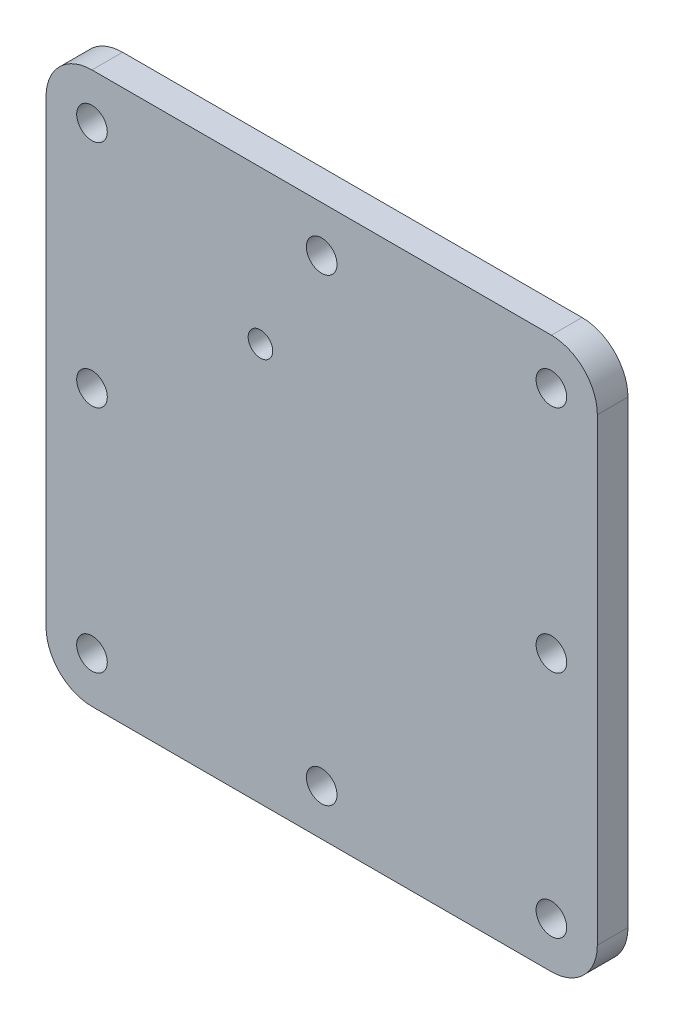
ISO-10303-21;
HEADER;
FILE_DESCRIPTION(('STEP AP214'),'2;1');
FILE_NAME('part.step','',(''),(''),'','','');
FILE_SCHEMA(('AUTOMOTIVE_DESIGN { 1 0 10303 214 1 1 1 1 }'));
ENDSEC;
DATA;
#1=APPLICATION_CONTEXT('core data for automotive mechanical design processes');
#2=APPLICATION_PROTOCOL_DEFINITION('international standard','automotive_design',2000,#1);
#3=PRODUCT_CONTEXT('',#1,'mechanical');
#4=PRODUCT('Part','Part','',(#3));
#5=PRODUCT_RELATED_PRODUCT_CATEGORY('part','',(#4));
#6=PRODUCT_DEFINITION_FORMATION('','',#4);
#7=PRODUCT_DEFINITION_CONTEXT('part definition',#1,'design');
#8=PRODUCT_DEFINITION('design','',#6,#7);
#9=PRODUCT_DEFINITION_SHAPE('','',#8);
#10=(LENGTH_UNIT() NAMED_UNIT(*) SI_UNIT(.MILLI.,.METRE.));
#11=(NAMED_UNIT(*) PLANE_ANGLE_UNIT() SI_UNIT($,.RADIAN.));
#12=(NAMED_UNIT(*) SI_UNIT($,.STERADIAN.) SOLID_ANGLE_UNIT());
#13=UNCERTAINTY_MEASURE_WITH_UNIT(LENGTH_MEASURE(1.E-05),#10,'distance_accuracy_value','');
#14=(GEOMETRIC_REPRESENTATION_CONTEXT(3) GLOBAL_UNCERTAINTY_ASSIGNED_CONTEXT((#13)) GLOBAL_UNIT_ASSIGNED_CONTEXT((#10,
#11,#12)) REPRESENTATION_CONTEXT('',''));
#15=CARTESIAN_POINT('',(0.,0.,0.));
#16=DIRECTION('',(0.,0.,1.));
#17=DIRECTION('',(1.,0.,0.));
#18=AXIS2_PLACEMENT_3D('',#15,#16,#17);
#19=CARTESIAN_POINT('',(-75.,-75.,10.));
#20=DIRECTION('',(0.,0.,1.));
#21=DIRECTION('',(1.,0.,0.));
#22=AXIS2_PLACEMENT_3D('',#19,#20,#21);
#23=PLANE('',#22);
#24=CARTESIAN_POINT('',(-20.,40.,10.));
#25=DIRECTION('',(0.,0.,1.));
#26=DIRECTION('',(1.,0.,0.));
#27=AXIS2_PLACEMENT_3D('',#24,#25,#26);
#28=CIRCLE('',#27,4.);
#29=CARTESIAN_POINT('',(-16.,40.,10.));
#30=VERTEX_POINT('',#29);
#31=EDGE_CURVE('E227',#30,#30,#28,.T.);
#32=ORIENTED_EDGE('',*,*,#31,.F.);
#33=EDGE_LOOP('',(#32));
#34=FACE_BOUND('',#33,.T.);
#35=CARTESIAN_POINT('',(1.54341102686378E-12,-75.,10.));
#36=DIRECTION('',(0.,0.,1.));
#37=DIRECTION('',(1.,0.,0.));
#38=AXIS2_PLACEMENT_3D('',#35,#36,#37);
#39=CIRCLE('',#38,5.);
#40=CARTESIAN_POINT('',(5.00000000000154,-75.,10.));
#41=VERTEX_POINT('',#40);
#42=EDGE_CURVE('E212',#41,#41,#39,.T.);
#43=ORIENTED_EDGE('',*,*,#42,.F.);
#44=EDGE_LOOP('',(#43));
#45=FACE_BOUND('',#44,.T.);
#46=CARTESIAN_POINT('',(75.0000000000008,0.,10.));
#47=DIRECTION('',(0.,0.,1.));
#48=DIRECTION('',(1.,0.,0.));
#49=AXIS2_PLACEMENT_3D('',#46,#47,#48);
#50=CIRCLE('',#49,5.);
#51=CARTESIAN_POINT('',(80.0000000000008,0.,10.));
#52=VERTEX_POINT('',#51);
#53=EDGE_CURVE('E200',#52,#52,#50,.T.);
#54=ORIENTED_EDGE('',*,*,#53,.F.);
#55=EDGE_LOOP('',(#54));
#56=FACE_BOUND('',#55,.T.);
#57=CARTESIAN_POINT('',(75.,75.,10.));
#58=DIRECTION('',(0.,0.,1.));
#59=DIRECTION('',(1.,0.,0.));
#60=AXIS2_PLACEMENT_3D('',#57,#58,#59);
#61=CIRCLE('',#60,5.00000000000001);
#62=CARTESIAN_POINT('',(80.,75.,10.));
#63=VERTEX_POINT('',#62);
#64=EDGE_CURVE('E188',#63,#63,#61,.T.);
#65=ORIENTED_EDGE('',*,*,#64,.F.);
#66=EDGE_LOOP('',(#65));
#67=FACE_BOUND('',#66,.T.);
#68=CARTESIAN_POINT('',(-75.,75.,10.));
#69=DIRECTION('',(0.,0.,1.));
#70=DIRECTION('',(1.,0.,0.));
#71=AXIS2_PLACEMENT_3D('',#68,#69,#70);
#72=CIRCLE('',#71,5.00000000000001);
#73=CARTESIAN_POINT('',(-70.,75.,10.));
#74=VERTEX_POINT('',#73);
#75=EDGE_CURVE('E134',#74,#74,#72,.T.);
#76=ORIENTED_EDGE('',*,*,#75,.F.);
#77=EDGE_LOOP('',(#76));
#78=FACE_BOUND('',#77,.T.);
#79=CARTESIAN_POINT('',(-75.,-75.,10.));
#80=DIRECTION('',(0.,0.,1.));
#81=DIRECTION('',(1.,0.,0.));
#82=AXIS2_PLACEMENT_3D('',#79,#80,#81);
#83=CIRCLE('',#82,15.);
#84=CARTESIAN_POINT('',(-90.,-74.9999999999999,10.));
#85=VERTEX_POINT('',#84);
#86=CARTESIAN_POINT('',(-74.9999999999999,-90.,10.));
#87=VERTEX_POINT('',#86);
#88=EDGE_CURVE('E145',#85,#87,#83,.T.);
#89=ORIENTED_EDGE('',*,*,#88,.T.);
#90=DIRECTION('',(1.,0.,0.));
#91=VECTOR('',#90,1.);
#92=CARTESIAN_POINT('',(-74.9999999999999,-90.,10.));
#93=LINE('',#92,#91);
#94=CARTESIAN_POINT('',(75.,-89.9999999999992,10.));
#95=VERTEX_POINT('',#94);
#96=EDGE_CURVE('E93',#87,#95,#93,.T.);
#97=ORIENTED_EDGE('',*,*,#96,.T.);
#98=CARTESIAN_POINT('',(75.,-74.9999999999992,10.));
#99=DIRECTION('',(0.,0.,1.));
#100=DIRECTION('',(1.,0.,0.));
#101=AXIS2_PLACEMENT_3D('',#98,#99,#100);
#102=CIRCLE('',#101,15.);
#103=CARTESIAN_POINT('',(90.,-75.,10.));
#104=VERTEX_POINT('',#103);
#105=EDGE_CURVE('E160',#95,#104,#102,.T.);
#106=ORIENTED_EDGE('',*,*,#105,.T.);
#107=DIRECTION('',(0.,1.,0.));
#108=VECTOR('',#107,1.);
#109=CARTESIAN_POINT('',(90.,75.0000000000019,10.));
#110=LINE('',#109,#108);
#111=CARTESIAN_POINT('',(90.,75.0000000000019,10.));
#112=VERTEX_POINT('',#111);
#113=EDGE_CURVE('E173',#104,#112,#110,.T.);
#114=ORIENTED_EDGE('',*,*,#113,.T.);
#115=CARTESIAN_POINT('',(75.,75.,10.));
#116=DIRECTION('',(0.,0.,1.));
#117=DIRECTION('',(-1.,0.,0.));
#118=AXIS2_PLACEMENT_3D('',#115,#116,#117);
#119=CIRCLE('',#118,15.);
#120=CARTESIAN_POINT('',(74.9999999999999,90.,10.));
#121=VERTEX_POINT('',#120);
#122=EDGE_CURVE('E112',#112,#121,#119,.T.);
#123=ORIENTED_EDGE('',*,*,#122,.T.);
#124=DIRECTION('',(-1.,0.,0.));
#125=VECTOR('',#124,1.);
#126=CARTESIAN_POINT('',(-74.9999999999999,90.,10.));
#127=LINE('',#126,#125);
#128=CARTESIAN_POINT('',(-74.9999999999999,90.,10.));
#129=VERTEX_POINT('',#128);
#130=EDGE_CURVE('E106',#121,#129,#127,.T.);
#131=ORIENTED_EDGE('',*,*,#130,.T.);
#132=CARTESIAN_POINT('',(-75.,75.,10.));
#133=DIRECTION('',(0.,0.,1.));
#134=DIRECTION('',(1.,0.,0.));
#135=AXIS2_PLACEMENT_3D('',#132,#133,#134);
#136=CIRCLE('',#135,15.);
#137=CARTESIAN_POINT('',(-90.,74.9999999999999,10.));
#138=VERTEX_POINT('',#137);
#139=EDGE_CURVE('E110',#129,#138,#136,.T.);
#140=ORIENTED_EDGE('',*,*,#139,.T.);
#141=DIRECTION('',(0.,-1.,0.));
#142=VECTOR('',#141,1.);
#143=CARTESIAN_POINT('',(-90.,74.9999999999999,10.));
#144=LINE('',#143,#142);
#145=EDGE_CURVE('E50',#138,#85,#144,.T.);
#146=ORIENTED_EDGE('',*,*,#145,.T.);
#147=EDGE_LOOP('',(#89,#97,#106,#114,#123,#131,#140,#146));
#148=FACE_BOUND('',#147,.T.);
#149=CARTESIAN_POINT('',(0.,75.,10.));
#150=DIRECTION('',(0.,0.,1.));
#151=DIRECTION('',(1.,0.,0.));
#152=AXIS2_PLACEMENT_3D('',#149,#150,#151);
#153=CIRCLE('',#152,5.);
#154=CARTESIAN_POINT('',(4.99999999999997,75.,10.));
#155=VERTEX_POINT('',#154);
#156=EDGE_CURVE('E182',#155,#155,#153,.T.);
#157=ORIENTED_EDGE('',*,*,#156,.F.);
#158=EDGE_LOOP('',(#157));
#159=FACE_BOUND('',#158,.T.);
#160=CARTESIAN_POINT('',(-74.9999999999992,0.,10.));
#161=DIRECTION('',(0.,0.,1.));
#162=DIRECTION('',(1.,0.,0.));
#163=AXIS2_PLACEMENT_3D('',#160,#161,#162);
#164=CIRCLE('',#163,5.);
#165=CARTESIAN_POINT('',(-69.9999999999992,0.,10.));
#166=VERTEX_POINT('',#165);
#167=EDGE_CURVE('E194',#166,#166,#164,.T.);
#168=ORIENTED_EDGE('',*,*,#167,.F.);
#169=EDGE_LOOP('',(#168));
#170=FACE_BOUND('',#169,.T.);
#171=CARTESIAN_POINT('',(-74.9999999999985,-75.,10.));
#172=DIRECTION('',(0.,0.,1.));
#173=DIRECTION('',(1.,0.,0.));
#174=AXIS2_PLACEMENT_3D('',#171,#172,#173);
#175=CIRCLE('',#174,5.00000000000001);
#176=CARTESIAN_POINT('',(-69.9999999999985,-75.,10.));
#177=VERTEX_POINT('',#176);
#178=EDGE_CURVE('E206',#177,#177,#175,.T.);
#179=ORIENTED_EDGE('',*,*,#178,.F.);
#180=EDGE_LOOP('',(#179));
#181=FACE_BOUND('',#180,.T.);
#182=CARTESIAN_POINT('',(75.0000000000015,-75.,10.));
#183=DIRECTION('',(0.,0.,1.));
#184=DIRECTION('',(1.,0.,0.));
#185=AXIS2_PLACEMENT_3D('',#182,#183,#184);
#186=CIRCLE('',#185,5.00000000000001);
#187=CARTESIAN_POINT('',(80.0000000000015,-75.,10.));
#188=VERTEX_POINT('',#187);
#189=EDGE_CURVE('E218',#188,#188,#186,.T.);
#190=ORIENTED_EDGE('',*,*,#189,.F.);
#191=EDGE_LOOP('',(#190));
#192=FACE_BOUND('',#191,.T.);
#193=ADVANCED_FACE('F33',(#34,#45,#56,#67,#78,#148,#159,#170,#181,#192),#23,.T.);
#194=CARTESIAN_POINT('',(-75.,-75.,0.));
#195=DIRECTION('',(0.,0.,1.));
#196=DIRECTION('',(1.,0.,0.));
#197=AXIS2_PLACEMENT_3D('',#194,#195,#196);
#198=PLANE('',#197);
#199=CARTESIAN_POINT('',(-20.,40.,0.));
#200=DIRECTION('',(0.,0.,1.));
#201=DIRECTION('',(1.,0.,0.));
#202=AXIS2_PLACEMENT_3D('',#199,#200,#201);
#203=CIRCLE('',#202,4.);
#204=CARTESIAN_POINT('',(-16.,40.,0.));
#205=VERTEX_POINT('',#204);
#206=EDGE_CURVE('E224',#205,#205,#203,.T.);
#207=ORIENTED_EDGE('',*,*,#206,.T.);
#208=EDGE_LOOP('',(#207));
#209=FACE_BOUND('',#208,.T.);
#210=CARTESIAN_POINT('',(-75.,-75.,0.));
#211=DIRECTION('',(0.,0.,1.));
#212=DIRECTION('',(1.,0.,0.));
#213=AXIS2_PLACEMENT_3D('',#210,#211,#212);
#214=CIRCLE('',#213,15.);
#215=CARTESIAN_POINT('',(-90.,-74.9999999999999,0.));
#216=VERTEX_POINT('',#215);
#217=CARTESIAN_POINT('',(-74.9999999999999,-90.,0.));
#218=VERTEX_POINT('',#217);
#219=EDGE_CURVE('E130',#216,#218,#214,.T.);
#220=ORIENTED_EDGE('',*,*,#219,.F.);
#221=DIRECTION('',(0.,-1.,0.));
#222=VECTOR('',#221,1.);
#223=CARTESIAN_POINT('',(-90.,74.9999999999999,0.));
#224=LINE('',#223,#222);
#225=CARTESIAN_POINT('',(-90.,74.9999999999999,0.));
#226=VERTEX_POINT('',#225);
#227=EDGE_CURVE('E85',#226,#216,#224,.T.);
#228=ORIENTED_EDGE('',*,*,#227,.F.);
#229=CARTESIAN_POINT('',(-75.,75.,0.));
#230=DIRECTION('',(0.,0.,1.));
#231=DIRECTION('',(1.,0.,0.));
#232=AXIS2_PLACEMENT_3D('',#229,#230,#231);
#233=CIRCLE('',#232,15.);
#234=CARTESIAN_POINT('',(-74.9999999999999,90.,0.));
#235=VERTEX_POINT('',#234);
#236=EDGE_CURVE('E79',#235,#226,#233,.T.);
#237=ORIENTED_EDGE('',*,*,#236,.F.);
#238=DIRECTION('',(-1.,0.,0.));
#239=VECTOR('',#238,1.);
#240=CARTESIAN_POINT('',(-74.9999999999999,90.,0.));
#241=LINE('',#240,#239);
#242=CARTESIAN_POINT('',(74.9999999999999,90.,0.));
#243=VERTEX_POINT('',#242);
#244=EDGE_CURVE('E120',#243,#235,#241,.T.);
#245=ORIENTED_EDGE('',*,*,#244,.F.);
#246=CARTESIAN_POINT('',(75.,75.,0.));
#247=DIRECTION('',(0.,0.,1.));
#248=DIRECTION('',(-1.,0.,0.));
#249=AXIS2_PLACEMENT_3D('',#246,#247,#248);
#250=CIRCLE('',#249,15.);
#251=CARTESIAN_POINT('',(90.,75.0000000000019,0.));
#252=VERTEX_POINT('',#251);
#253=EDGE_CURVE('E140',#252,#243,#250,.T.);
#254=ORIENTED_EDGE('',*,*,#253,.F.);
#255=DIRECTION('',(0.,1.,0.));
#256=VECTOR('',#255,1.);
#257=CARTESIAN_POINT('',(90.,75.0000000000019,0.));
#258=LINE('',#257,#256);
#259=CARTESIAN_POINT('',(90.,-75.,0.));
#260=VERTEX_POINT('',#259);
#261=EDGE_CURVE('E138',#260,#252,#258,.T.);
#262=ORIENTED_EDGE('',*,*,#261,.F.);
#263=CARTESIAN_POINT('',(75.,-74.9999999999992,0.));
#264=DIRECTION('',(0.,0.,1.));
#265=DIRECTION('',(1.,0.,0.));
#266=AXIS2_PLACEMENT_3D('',#263,#264,#265);
#267=CIRCLE('',#266,15.);
#268=CARTESIAN_POINT('',(75.,-89.9999999999992,0.));
#269=VERTEX_POINT('',#268);
#270=EDGE_CURVE('E136',#269,#260,#267,.T.);
#271=ORIENTED_EDGE('',*,*,#270,.F.);
#272=DIRECTION('',(1.,0.,0.));
#273=VECTOR('',#272,1.);
#274=CARTESIAN_POINT('',(-74.9999999999999,-90.,0.));
#275=LINE('',#274,#273);
#276=EDGE_CURVE('E133',#218,#269,#275,.T.);
#277=ORIENTED_EDGE('',*,*,#276,.F.);
#278=EDGE_LOOP('',(#220,#228,#237,#245,#254,#262,#271,#277));
#279=FACE_BOUND('',#278,.T.);
#280=CARTESIAN_POINT('',(-75.,75.,0.));
#281=DIRECTION('',(0.,0.,1.));
#282=DIRECTION('',(1.,0.,0.));
#283=AXIS2_PLACEMENT_3D('',#280,#281,#282);
#284=CIRCLE('',#283,5.00000000000001);
#285=CARTESIAN_POINT('',(-70.,75.,0.));
#286=VERTEX_POINT('',#285);
#287=EDGE_CURVE('E179',#286,#286,#284,.T.);
#288=ORIENTED_EDGE('',*,*,#287,.T.);
#289=EDGE_LOOP('',(#288));
#290=FACE_BOUND('',#289,.T.);
#291=CARTESIAN_POINT('',(0.,75.,0.));
#292=DIRECTION('',(0.,0.,1.));
#293=DIRECTION('',(1.,0.,0.));
#294=AXIS2_PLACEMENT_3D('',#291,#292,#293);
#295=CIRCLE('',#294,5.);
#296=CARTESIAN_POINT('',(4.99999999999997,75.,0.));
#297=VERTEX_POINT('',#296);
#298=EDGE_CURVE('E185',#297,#297,#295,.T.);
#299=ORIENTED_EDGE('',*,*,#298,.T.);
#300=EDGE_LOOP('',(#299));
#301=FACE_BOUND('',#300,.T.);
#302=CARTESIAN_POINT('',(75.,75.,0.));
#303=DIRECTION('',(0.,0.,1.));
#304=DIRECTION('',(1.,0.,0.));
#305=AXIS2_PLACEMENT_3D('',#302,#303,#304);
#306=CIRCLE('',#305,5.00000000000001);
#307=CARTESIAN_POINT('',(80.,75.,0.));
#308=VERTEX_POINT('',#307);
#309=EDGE_CURVE('E191',#308,#308,#306,.T.);
#310=ORIENTED_EDGE('',*,*,#309,.T.);
#311=EDGE_LOOP('',(#310));
#312=FACE_BOUND('',#311,.T.);
#313=CARTESIAN_POINT('',(-74.9999999999992,0.,0.));
#314=DIRECTION('',(0.,0.,1.));
#315=DIRECTION('',(1.,0.,0.));
#316=AXIS2_PLACEMENT_3D('',#313,#314,#315);
#317=CIRCLE('',#316,5.);
#318=CARTESIAN_POINT('',(-69.9999999999992,0.,0.));
#319=VERTEX_POINT('',#318);
#320=EDGE_CURVE('E197',#319,#319,#317,.T.);
#321=ORIENTED_EDGE('',*,*,#320,.T.);
#322=EDGE_LOOP('',(#321));
#323=FACE_BOUND('',#322,.T.);
#324=CARTESIAN_POINT('',(75.0000000000008,0.,0.));
#325=DIRECTION('',(0.,0.,1.));
#326=DIRECTION('',(1.,0.,0.));
#327=AXIS2_PLACEMENT_3D('',#324,#325,#326);
#328=CIRCLE('',#327,5.);
#329=CARTESIAN_POINT('',(80.0000000000008,0.,0.));
#330=VERTEX_POINT('',#329);
#331=EDGE_CURVE('E203',#330,#330,#328,.T.);
#332=ORIENTED_EDGE('',*,*,#331,.T.);
#333=EDGE_LOOP('',(#332));
#334=FACE_BOUND('',#333,.T.);
#335=CARTESIAN_POINT('',(-74.9999999999985,-75.,0.));
#336=DIRECTION('',(0.,0.,1.));
#337=DIRECTION('',(1.,0.,0.));
#338=AXIS2_PLACEMENT_3D('',#335,#336,#337);
#339=CIRCLE('',#338,5.00000000000001);
#340=CARTESIAN_POINT('',(-69.9999999999985,-75.,0.));
#341=VERTEX_POINT('',#340);
#342=EDGE_CURVE('E209',#341,#341,#339,.T.);
#343=ORIENTED_EDGE('',*,*,#342,.T.);
#344=EDGE_LOOP('',(#343));
#345=FACE_BOUND('',#344,.T.);
#346=CARTESIAN_POINT('',(1.54341102686378E-12,-75.,0.));
#347=DIRECTION('',(0.,0.,1.));
#348=DIRECTION('',(1.,0.,0.));
#349=AXIS2_PLACEMENT_3D('',#346,#347,#348);
#350=CIRCLE('',#349,5.);
#351=CARTESIAN_POINT('',(5.00000000000154,-75.,0.));
#352=VERTEX_POINT('',#351);
#353=EDGE_CURVE('E215',#352,#352,#350,.T.);
#354=ORIENTED_EDGE('',*,*,#353,.T.);
#355=EDGE_LOOP('',(#354));
#356=FACE_BOUND('',#355,.T.);
#357=CARTESIAN_POINT('',(75.0000000000015,-75.,0.));
#358=DIRECTION('',(0.,0.,1.));
#359=DIRECTION('',(1.,0.,0.));
#360=AXIS2_PLACEMENT_3D('',#357,#358,#359);
#361=CIRCLE('',#360,5.00000000000001);
#362=CARTESIAN_POINT('',(80.0000000000015,-75.,0.));
#363=VERTEX_POINT('',#362);
#364=EDGE_CURVE('E221',#363,#363,#361,.T.);
#365=ORIENTED_EDGE('',*,*,#364,.T.);
#366=EDGE_LOOP('',(#365));
#367=FACE_BOUND('',#366,.T.);
#368=ADVANCED_FACE('F164',(#209,#279,#290,#301,#312,#323,#334,#345,#356,#367),#198,.F.);
#369=CARTESIAN_POINT('',(-75.,-75.,10.));
#370=DIRECTION('',(0.,0.,-1.));
#371=DIRECTION('',(-1.,0.,0.));
#372=AXIS2_PLACEMENT_3D('',#369,#370,#371);
#373=CYLINDRICAL_SURFACE('',#372,15.);
#374=ORIENTED_EDGE('',*,*,#219,.T.);
#375=DIRECTION('',(0.,0.,-1.));
#376=VECTOR('',#375,1.);
#377=CARTESIAN_POINT('',(-74.9999999999999,-90.,10.));
#378=LINE('',#377,#376);
#379=EDGE_CURVE('E11',#87,#218,#378,.T.);
#380=ORIENTED_EDGE('',*,*,#379,.F.);
#381=ORIENTED_EDGE('',*,*,#88,.F.);
#382=DIRECTION('',(0.,0.,-1.));
#383=VECTOR('',#382,1.);
#384=CARTESIAN_POINT('',(-90.,-74.9999999999999,10.));
#385=LINE('',#384,#383);
#386=EDGE_CURVE('E126',#85,#216,#385,.T.);
#387=ORIENTED_EDGE('',*,*,#386,.T.);
#388=EDGE_LOOP('',(#374,#380,#381,#387));
#389=FACE_BOUND('',#388,.T.);
#390=ADVANCED_FACE('F35',(#389),#373,.T.);
#391=CARTESIAN_POINT('',(-74.9999999999999,-90.,10.));
#392=DIRECTION('',(0.,1.,0.));
#393=DIRECTION('',(-1.,0.,0.));
#394=AXIS2_PLACEMENT_3D('',#391,#392,#393);
#395=PLANE('',#394);
#396=ORIENTED_EDGE('',*,*,#276,.T.);
#397=DIRECTION('',(0.,0.,-1.));
#398=VECTOR('',#397,1.);
#399=CARTESIAN_POINT('',(75.,-89.9999999999992,10.));
#400=LINE('',#399,#398);
#401=EDGE_CURVE('E42',#95,#269,#400,.T.);
#402=ORIENTED_EDGE('',*,*,#401,.F.);
#403=ORIENTED_EDGE('',*,*,#96,.F.);
#404=ORIENTED_EDGE('',*,*,#379,.T.);
#405=EDGE_LOOP('',(#396,#402,#403,#404));
#406=FACE_BOUND('',#405,.T.);
#407=ADVANCED_FACE('F316',(#406),#395,.F.);
#408=CARTESIAN_POINT('',(75.,-74.9999999999992,10.));
#409=DIRECTION('',(0.,0.,-1.));
#410=DIRECTION('',(-1.,0.,0.));
#411=AXIS2_PLACEMENT_3D('',#408,#409,#410);
#412=CYLINDRICAL_SURFACE('',#411,15.);
#413=ORIENTED_EDGE('',*,*,#270,.T.);
#414=DIRECTION('',(0.,0.,-1.));
#415=VECTOR('',#414,1.);
#416=CARTESIAN_POINT('',(90.,-75.,10.));
#417=LINE('',#416,#415);
#418=EDGE_CURVE('E152',#104,#260,#417,.T.);
#419=ORIENTED_EDGE('',*,*,#418,.F.);
#420=ORIENTED_EDGE('',*,*,#105,.F.);
#421=ORIENTED_EDGE('',*,*,#401,.T.);
#422=EDGE_LOOP('',(#413,#419,#420,#421));
#423=FACE_BOUND('',#422,.T.);
#424=ADVANCED_FACE('F158',(#423),#412,.T.);
#425=CARTESIAN_POINT('',(90.,75.0000000000019,10.));
#426=DIRECTION('',(-1.,0.,0.));
#427=DIRECTION('',(0.,-1.,0.));
#428=AXIS2_PLACEMENT_3D('',#425,#426,#427);
#429=PLANE('',#428);
#430=ORIENTED_EDGE('',*,*,#261,.T.);
#431=DIRECTION('',(0.,0.,-1.));
#432=VECTOR('',#431,1.);
#433=CARTESIAN_POINT('',(90.,75.0000000000019,10.));
#434=LINE('',#433,#432);
#435=EDGE_CURVE('E149',#112,#252,#434,.T.);
#436=ORIENTED_EDGE('',*,*,#435,.F.);
#437=ORIENTED_EDGE('',*,*,#113,.F.);
#438=ORIENTED_EDGE('',*,*,#418,.T.);
#439=EDGE_LOOP('',(#430,#436,#437,#438));
#440=FACE_BOUND('',#439,.T.);
#441=ADVANCED_FACE('F169',(#440),#429,.F.);
#442=CARTESIAN_POINT('',(75.,75.,10.));
#443=DIRECTION('',(0.,0.,-1.));
#444=DIRECTION('',(-1.,0.,0.));
#445=AXIS2_PLACEMENT_3D('',#442,#443,#444);
#446=CYLINDRICAL_SURFACE('',#445,15.);
#447=ORIENTED_EDGE('',*,*,#253,.T.);
#448=DIRECTION('',(0.,0.,-1.));
#449=VECTOR('',#448,1.);
#450=CARTESIAN_POINT('',(74.9999999999999,90.,10.));
#451=LINE('',#450,#449);
#452=EDGE_CURVE('E121',#121,#243,#451,.T.);
#453=ORIENTED_EDGE('',*,*,#452,.F.);
#454=ORIENTED_EDGE('',*,*,#122,.F.);
#455=ORIENTED_EDGE('',*,*,#435,.T.);
#456=EDGE_LOOP('',(#447,#453,#454,#455));
#457=FACE_BOUND('',#456,.T.);
#458=ADVANCED_FACE('F172',(#457),#446,.T.);
#459=CARTESIAN_POINT('',(-74.9999999999999,90.,10.));
#460=DIRECTION('',(0.,-1.,0.));
#461=DIRECTION('',(0.,0.,-1.));
#462=AXIS2_PLACEMENT_3D('',#459,#460,#461);
#463=PLANE('',#462);
#464=ORIENTED_EDGE('',*,*,#244,.T.);
#465=DIRECTION('',(0.,0.,-1.));
#466=VECTOR('',#465,1.);
#467=CARTESIAN_POINT('',(-74.9999999999999,90.,10.));
#468=LINE('',#467,#466);
#469=EDGE_CURVE('E117',#129,#235,#468,.T.);
#470=ORIENTED_EDGE('',*,*,#469,.F.);
#471=ORIENTED_EDGE('',*,*,#130,.F.);
#472=ORIENTED_EDGE('',*,*,#452,.T.);
#473=EDGE_LOOP('',(#464,#470,#471,#472));
#474=FACE_BOUND('',#473,.T.);
#475=ADVANCED_FACE('F118',(#474),#463,.F.);
#476=CARTESIAN_POINT('',(-75.,75.,10.));
#477=DIRECTION('',(0.,0.,-1.));
#478=DIRECTION('',(-1.,0.,0.));
#479=AXIS2_PLACEMENT_3D('',#476,#477,#478);
#480=CYLINDRICAL_SURFACE('',#479,15.);
#481=ORIENTED_EDGE('',*,*,#236,.T.);
#482=DIRECTION('',(0.,0.,-1.));
#483=VECTOR('',#482,1.);
#484=CARTESIAN_POINT('',(-90.,74.9999999999999,10.));
#485=LINE('',#484,#483);
#486=EDGE_CURVE('E122',#138,#226,#485,.T.);
#487=ORIENTED_EDGE('',*,*,#486,.F.);
#488=ORIENTED_EDGE('',*,*,#139,.F.);
#489=ORIENTED_EDGE('',*,*,#469,.T.);
#490=EDGE_LOOP('',(#481,#487,#488,#489));
#491=FACE_BOUND('',#490,.T.);
#492=ADVANCED_FACE('F124',(#491),#480,.T.);
#493=CARTESIAN_POINT('',(-90.,74.9999999999999,10.));
#494=DIRECTION('',(1.,0.,0.));
#495=DIRECTION('',(0.,1.,0.));
#496=AXIS2_PLACEMENT_3D('',#493,#494,#495);
#497=PLANE('',#496);
#498=ORIENTED_EDGE('',*,*,#227,.T.);
#499=ORIENTED_EDGE('',*,*,#386,.F.);
#500=ORIENTED_EDGE('',*,*,#145,.F.);
#501=ORIENTED_EDGE('',*,*,#486,.T.);
#502=EDGE_LOOP('',(#498,#499,#500,#501));
#503=FACE_BOUND('',#502,.T.);
#504=ADVANCED_FACE('F256',(#503),#497,.F.);
#505=CARTESIAN_POINT('',(-75.,75.,10.));
#506=DIRECTION('',(0.,0.,-1.));
#507=DIRECTION('',(-1.,0.,0.));
#508=AXIS2_PLACEMENT_3D('',#505,#506,#507);
#509=CYLINDRICAL_SURFACE('',#508,5.00000000000001);
#510=ORIENTED_EDGE('',*,*,#75,.T.);
#511=EDGE_LOOP('',(#510));
#512=FACE_BOUND('',#511,.T.);
#513=ORIENTED_EDGE('',*,*,#287,.F.);
#514=EDGE_LOOP('',(#513));
#515=FACE_BOUND('',#514,.T.);
#516=ADVANCED_FACE('F252',(#512,#515),#509,.F.);
#517=CARTESIAN_POINT('',(0.,75.,10.));
#518=DIRECTION('',(0.,0.,-1.));
#519=DIRECTION('',(-1.,0.,0.));
#520=AXIS2_PLACEMENT_3D('',#517,#518,#519);
#521=CYLINDRICAL_SURFACE('',#520,5.);
#522=ORIENTED_EDGE('',*,*,#156,.T.);
#523=EDGE_LOOP('',(#522));
#524=FACE_BOUND('',#523,.T.);
#525=ORIENTED_EDGE('',*,*,#298,.F.);
#526=EDGE_LOOP('',(#525));
#527=FACE_BOUND('',#526,.T.);
#528=ADVANCED_FACE('F255',(#524,#527),#521,.F.);
#529=CARTESIAN_POINT('',(75.,75.,10.));
#530=DIRECTION('',(0.,0.,-1.));
#531=DIRECTION('',(-1.,0.,0.));
#532=AXIS2_PLACEMENT_3D('',#529,#530,#531);
#533=CYLINDRICAL_SURFACE('',#532,5.00000000000001);
#534=ORIENTED_EDGE('',*,*,#64,.T.);
#535=EDGE_LOOP('',(#534));
#536=FACE_BOUND('',#535,.T.);
#537=ORIENTED_EDGE('',*,*,#309,.F.);
#538=EDGE_LOOP('',(#537));
#539=FACE_BOUND('',#538,.T.);
#540=ADVANCED_FACE('F297',(#536,#539),#533,.F.);
#541=CARTESIAN_POINT('',(-74.9999999999992,0.,10.));
#542=DIRECTION('',(0.,0.,-1.));
#543=DIRECTION('',(-1.,0.,0.));
#544=AXIS2_PLACEMENT_3D('',#541,#542,#543);
#545=CYLINDRICAL_SURFACE('',#544,5.);
#546=ORIENTED_EDGE('',*,*,#167,.T.);
#547=EDGE_LOOP('',(#546));
#548=FACE_BOUND('',#547,.T.);
#549=ORIENTED_EDGE('',*,*,#320,.F.);
#550=EDGE_LOOP('',(#549));
#551=FACE_BOUND('',#550,.T.);
#552=ADVANCED_FACE('F293',(#548,#551),#545,.F.);
#553=CARTESIAN_POINT('',(75.0000000000008,0.,10.));
#554=DIRECTION('',(0.,0.,-1.));
#555=DIRECTION('',(-1.,0.,0.));
#556=AXIS2_PLACEMENT_3D('',#553,#554,#555);
#557=CYLINDRICAL_SURFACE('',#556,5.);
#558=ORIENTED_EDGE('',*,*,#53,.T.);
#559=EDGE_LOOP('',(#558));
#560=FACE_BOUND('',#559,.T.);
#561=ORIENTED_EDGE('',*,*,#331,.F.);
#562=EDGE_LOOP('',(#561));
#563=FACE_BOUND('',#562,.T.);
#564=ADVANCED_FACE('F289',(#560,#563),#557,.F.);
#565=CARTESIAN_POINT('',(-74.9999999999985,-75.,10.));
#566=DIRECTION('',(0.,0.,-1.));
#567=DIRECTION('',(-1.,0.,0.));
#568=AXIS2_PLACEMENT_3D('',#565,#566,#567);
#569=CYLINDRICAL_SURFACE('',#568,5.00000000000001);
#570=ORIENTED_EDGE('',*,*,#178,.T.);
#571=EDGE_LOOP('',(#570));
#572=FACE_BOUND('',#571,.T.);
#573=ORIENTED_EDGE('',*,*,#342,.F.);
#574=EDGE_LOOP('',(#573));
#575=FACE_BOUND('',#574,.T.);
#576=ADVANCED_FACE('F283',(#572,#575),#569,.F.);
#577=CARTESIAN_POINT('',(1.54341102686378E-12,-75.,10.));
#578=DIRECTION('',(0.,0.,-1.));
#579=DIRECTION('',(-1.,0.,0.));
#580=AXIS2_PLACEMENT_3D('',#577,#578,#579);
#581=CYLINDRICAL_SURFACE('',#580,5.);
#582=ORIENTED_EDGE('',*,*,#42,.T.);
#583=EDGE_LOOP('',(#582));
#584=FACE_BOUND('',#583,.T.);
#585=ORIENTED_EDGE('',*,*,#353,.F.);
#586=EDGE_LOOP('',(#585));
#587=FACE_BOUND('',#586,.T.);
#588=ADVANCED_FACE('F277',(#584,#587),#581,.F.);
#589=CARTESIAN_POINT('',(75.0000000000015,-75.,10.));
#590=DIRECTION('',(0.,0.,-1.));
#591=DIRECTION('',(-1.,0.,0.));
#592=AXIS2_PLACEMENT_3D('',#589,#590,#591);
#593=CYLINDRICAL_SURFACE('',#592,5.00000000000001);
#594=ORIENTED_EDGE('',*,*,#189,.T.);
#595=EDGE_LOOP('',(#594));
#596=FACE_BOUND('',#595,.T.);
#597=ORIENTED_EDGE('',*,*,#364,.F.);
#598=EDGE_LOOP('',(#597));
#599=FACE_BOUND('',#598,.T.);
#600=ADVANCED_FACE('F237',(#596,#599),#593,.F.);
#601=CARTESIAN_POINT('',(-20.,40.,0.));
#602=DIRECTION('',(0.,0.,1.));
#603=DIRECTION('',(1.,0.,0.));
#604=AXIS2_PLACEMENT_3D('',#601,#602,#603);
#605=CYLINDRICAL_SURFACE('',#604,4.);
#606=ORIENTED_EDGE('',*,*,#206,.F.);
#607=EDGE_LOOP('',(#606));
#608=FACE_BOUND('',#607,.T.);
#609=ORIENTED_EDGE('',*,*,#31,.T.);
#610=EDGE_LOOP('',(#609));
#611=FACE_BOUND('',#610,.T.);
#612=ADVANCED_FACE('F234',(#608,#611),#605,.F.);
#613=CLOSED_SHELL('',(#193,#368,#390,#407,#424,#441,#458,#475,#492,#504,#516,#528,#540,#552,
#564,#576,#588,#600,#612));
#614=MANIFOLD_SOLID_BREP('B2',#613);
#615=ADVANCED_BREP_SHAPE_REPRESENTATION('',(#18,#614),#14);
#616=SHAPE_DEFINITION_REPRESENTATION(#9,#615);
ENDSEC;
END-ISO-10303-21;
